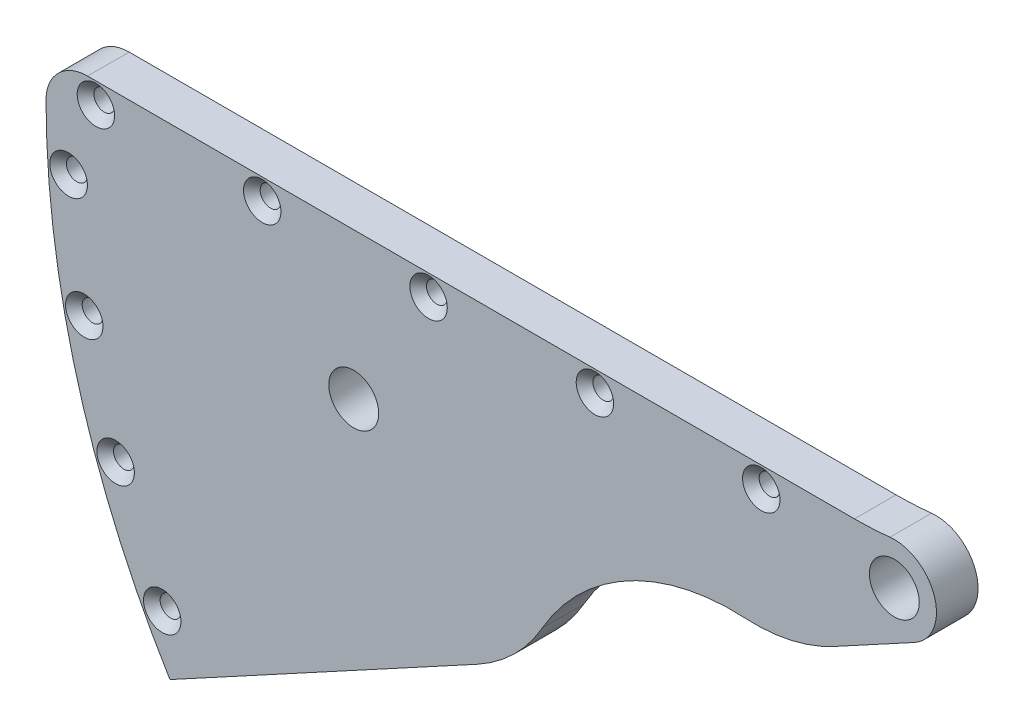
ISO-10303-21;
HEADER;
FILE_DESCRIPTION(('STEP AP214'),'2;1');
FILE_NAME('part.step','',(''),(''),'','','');
FILE_SCHEMA(('AUTOMOTIVE_DESIGN { 1 0 10303 214 1 1 1 1 }'));
ENDSEC;
DATA;
#1=APPLICATION_CONTEXT('core data for automotive mechanical design processes');
#2=APPLICATION_PROTOCOL_DEFINITION('international standard','automotive_design',2000,#1);
#3=PRODUCT_CONTEXT('',#1,'mechanical');
#4=PRODUCT('Part','Part','',(#3));
#5=PRODUCT_RELATED_PRODUCT_CATEGORY('part','',(#4));
#6=PRODUCT_DEFINITION_FORMATION('','',#4);
#7=PRODUCT_DEFINITION_CONTEXT('part definition',#1,'design');
#8=PRODUCT_DEFINITION('design','',#6,#7);
#9=PRODUCT_DEFINITION_SHAPE('','',#8);
#10=(LENGTH_UNIT() NAMED_UNIT(*) SI_UNIT(.MILLI.,.METRE.));
#11=(NAMED_UNIT(*) PLANE_ANGLE_UNIT() SI_UNIT($,.RADIAN.));
#12=(NAMED_UNIT(*) SI_UNIT($,.STERADIAN.) SOLID_ANGLE_UNIT());
#13=UNCERTAINTY_MEASURE_WITH_UNIT(LENGTH_MEASURE(1.E-05),#10,'distance_accuracy_value','');
#14=(GEOMETRIC_REPRESENTATION_CONTEXT(3) GLOBAL_UNCERTAINTY_ASSIGNED_CONTEXT((#13)) GLOBAL_UNIT_ASSIGNED_CONTEXT((#10,
#11,#12)) REPRESENTATION_CONTEXT('',''));
#15=CARTESIAN_POINT('',(0.,0.,0.));
#16=DIRECTION('',(0.,0.,1.));
#17=DIRECTION('',(1.,0.,0.));
#18=AXIS2_PLACEMENT_3D('',#15,#16,#17);
#19=CARTESIAN_POINT('',(70.,-12.3683000000001,10.));
#20=DIRECTION('',(0.,0.,1.));
#21=DIRECTION('',(1.,0.,0.));
#22=AXIS2_PLACEMENT_3D('',#19,#20,#21);
#23=PLANE('',#22);
#24=CARTESIAN_POINT('',(-106.053120049398,-105.138440243897,10.));
#25=DIRECTION('',(0.,0.,1.));
#26=DIRECTION('',(1.,0.,0.));
#27=AXIS2_PLACEMENT_3D('',#24,#25,#26);
#28=CIRCLE('',#27,4.50000000000003);
#29=CARTESIAN_POINT('',(-101.553120049398,-105.138440243897,10.));
#30=VERTEX_POINT('',#29);
#31=EDGE_CURVE('E202',#30,#30,#28,.F.);
#32=ORIENTED_EDGE('',*,*,#31,.T.);
#33=EDGE_LOOP('',(#32));
#34=FACE_BOUND('',#33,.T.);
#35=CARTESIAN_POINT('',(-117.250891281488,-79.7337489652391,10.));
#36=DIRECTION('',(0.,0.,1.));
#37=DIRECTION('',(1.,0.,0.));
#38=AXIS2_PLACEMENT_3D('',#35,#36,#37);
#39=CIRCLE('',#38,4.50000000000005);
#40=CARTESIAN_POINT('',(-112.750891281488,-79.7337489652391,10.));
#41=VERTEX_POINT('',#40);
#42=EDGE_CURVE('E199',#41,#41,#39,.F.);
#43=ORIENTED_EDGE('',*,*,#42,.T.);
#44=EDGE_LOOP('',(#43));
#45=FACE_BOUND('',#44,.T.);
#46=CARTESIAN_POINT('',(-124.804036909517,-53.0178658495351,10.));
#47=DIRECTION('',(0.,0.,1.));
#48=DIRECTION('',(1.,0.,0.));
#49=AXIS2_PLACEMENT_3D('',#46,#47,#48);
#50=CIRCLE('',#49,4.50000000000002);
#51=CARTESIAN_POINT('',(-120.304036909517,-53.0178658495351,10.));
#52=VERTEX_POINT('',#51);
#53=EDGE_CURVE('E196',#52,#52,#50,.F.);
#54=ORIENTED_EDGE('',*,*,#53,.T.);
#55=EDGE_LOOP('',(#54));
#56=FACE_BOUND('',#55,.T.);
#57=CARTESIAN_POINT('',(-128.565543545409,-25.5107851727687,10.));
#58=DIRECTION('',(0.,0.,1.));
#59=DIRECTION('',(1.,0.,0.));
#60=AXIS2_PLACEMENT_3D('',#57,#58,#59);
#61=CIRCLE('',#60,4.52853142709056);
#62=CARTESIAN_POINT('',(-124.037012118318,-25.5107851727687,10.));
#63=VERTEX_POINT('',#62);
#64=EDGE_CURVE('E193',#63,#63,#61,.F.);
#65=ORIENTED_EDGE('',*,*,#64,.T.);
#66=EDGE_LOOP('',(#65));
#67=FACE_BOUND('',#66,.T.);
#68=CARTESIAN_POINT('',(-60.,-38.0000000000001,10.));
#69=DIRECTION('',(0.,0.,1.));
#70=DIRECTION('',(1.,0.,0.));
#71=AXIS2_PLACEMENT_3D('',#68,#69,#70);
#72=CIRCLE('',#71,6.);
#73=CARTESIAN_POINT('',(-54.,-38.0000000000001,10.));
#74=VERTEX_POINT('',#73);
#75=EDGE_CURVE('E178',#74,#74,#72,.T.);
#76=ORIENTED_EDGE('',*,*,#75,.F.);
#77=EDGE_LOOP('',(#76));
#78=FACE_BOUND('',#77,.T.);
#79=CARTESIAN_POINT('',(70.,-12.3683000000001,10.));
#80=DIRECTION('',(0.,0.,1.));
#81=DIRECTION('',(1.,0.,0.));
#82=AXIS2_PLACEMENT_3D('',#79,#80,#81);
#83=CIRCLE('',#82,6.);
#84=CARTESIAN_POINT('',(76.,-12.3683000000001,10.));
#85=VERTEX_POINT('',#84);
#86=EDGE_CURVE('E174',#85,#85,#83,.T.);
#87=ORIENTED_EDGE('',*,*,#86,.F.);
#88=EDGE_LOOP('',(#87));
#89=FACE_BOUND('',#88,.T.);
#90=CARTESIAN_POINT('',(38.,-7.73660000000008,10.));
#91=DIRECTION('',(0.,0.,1.));
#92=DIRECTION('',(1.,0.,0.));
#93=AXIS2_PLACEMENT_3D('',#90,#91,#92);
#94=CIRCLE('',#93,4.50000000000003);
#95=CARTESIAN_POINT('',(42.5,-7.73660000000008,10.));
#96=VERTEX_POINT('',#95);
#97=EDGE_CURVE('E154',#96,#96,#94,.F.);
#98=ORIENTED_EDGE('',*,*,#97,.T.);
#99=EDGE_LOOP('',(#98));
#100=FACE_BOUND('',#99,.T.);
#101=CARTESIAN_POINT('',(-1.99999999999999,-7.73660000000007,10.));
#102=DIRECTION('',(0.,0.,1.));
#103=DIRECTION('',(1.,0.,0.));
#104=AXIS2_PLACEMENT_3D('',#101,#102,#103);
#105=CIRCLE('',#104,4.50000000000003);
#106=CARTESIAN_POINT('',(2.50000000000004,-7.73660000000007,10.));
#107=VERTEX_POINT('',#106);
#108=EDGE_CURVE('E151',#107,#107,#105,.F.);
#109=ORIENTED_EDGE('',*,*,#108,.T.);
#110=EDGE_LOOP('',(#109));
#111=FACE_BOUND('',#110,.T.);
#112=CARTESIAN_POINT('',(-42.,-7.73660000000007,10.));
#113=DIRECTION('',(0.,0.,1.));
#114=DIRECTION('',(1.,0.,0.));
#115=AXIS2_PLACEMENT_3D('',#112,#113,#114);
#116=CIRCLE('',#115,4.50000000000003);
#117=CARTESIAN_POINT('',(-37.5,-7.73660000000007,10.));
#118=VERTEX_POINT('',#117);
#119=EDGE_CURVE('E148',#118,#118,#116,.F.);
#120=ORIENTED_EDGE('',*,*,#119,.T.);
#121=EDGE_LOOP('',(#120));
#122=FACE_BOUND('',#121,.T.);
#123=CARTESIAN_POINT('',(-82.,-7.73660000000007,10.));
#124=DIRECTION('',(0.,0.,1.));
#125=DIRECTION('',(1.,0.,0.));
#126=AXIS2_PLACEMENT_3D('',#123,#124,#125);
#127=CIRCLE('',#126,4.50000000000003);
#128=CARTESIAN_POINT('',(-77.5,-7.73660000000007,10.));
#129=VERTEX_POINT('',#128);
#130=EDGE_CURVE('E145',#129,#129,#127,.F.);
#131=ORIENTED_EDGE('',*,*,#130,.T.);
#132=EDGE_LOOP('',(#131));
#133=FACE_BOUND('',#132,.T.);
#134=CARTESIAN_POINT('',(-122.,-7.73660000000007,10.));
#135=DIRECTION('',(0.,0.,1.));
#136=DIRECTION('',(1.,0.,0.));
#137=AXIS2_PLACEMENT_3D('',#134,#135,#136);
#138=CIRCLE('',#137,4.50000000000005);
#139=CARTESIAN_POINT('',(-117.5,-7.73660000000007,10.));
#140=VERTEX_POINT('',#139);
#141=EDGE_CURVE('E137',#140,#140,#138,.F.);
#142=ORIENTED_EDGE('',*,*,#141,.T.);
#143=EDGE_LOOP('',(#142));
#144=FACE_BOUND('',#143,.T.);
#145=CARTESIAN_POINT('',(70.,-12.3683000000001,10.));
#146=DIRECTION('',(0.,0.,1.));
#147=DIRECTION('',(1.,0.,0.));
#148=AXIS2_PLACEMENT_3D('',#145,#146,#147);
#149=CIRCLE('',#148,204.);
#150=CARTESIAN_POINT('',(-133.999632378806,-12.7555845360825,10.));
#151=VERTEX_POINT('',#150);
#152=CARTESIAN_POINT('',(-104.20534041752,-118.52148822351,10.));
#153=VERTEX_POINT('',#152);
#154=EDGE_CURVE('E121',#151,#153,#149,.T.);
#155=ORIENTED_EDGE('',*,*,#154,.T.);
#156=DIRECTION('',(0.878737629728587,0.477305120545532,0.));
#157=VECTOR('',#156,1.);
#158=CARTESIAN_POINT('',(-104.20534041752,-118.52148822351,10.));
#159=LINE('',#158,#157);
#160=CARTESIAN_POINT('',(-30.3442659503435,-78.4022673554259,10.));
#161=VERTEX_POINT('',#160);
#162=EDGE_CURVE('E110',#153,#161,#159,.T.);
#163=ORIENTED_EDGE('',*,*,#162,.T.);
#164=CARTESIAN_POINT('',(-49.4364707721648,-43.2527621662824,10.));
#165=DIRECTION('',(0.,0.,1.));
#166=DIRECTION('',(1.,0.,0.));
#167=AXIS2_PLACEMENT_3D('',#164,#165,#166);
#168=CIRCLE('',#167,40.);
#169=CARTESIAN_POINT('',(-14.6947042322307,-63.0772333492602,10.));
#170=VERTEX_POINT('',#169);
#171=EDGE_CURVE('E120',#161,#170,#168,.T.);
#172=ORIENTED_EDGE('',*,*,#171,.T.);
#173=CARTESIAN_POINT('',(31.1020131785029,-89.2099201699054,10.));
#174=DIRECTION('',(0.,0.,-1.));
#175=DIRECTION('',(1.,0.,0.));
#176=AXIS2_PLACEMENT_3D('',#173,#174,#175);
#177=CIRCLE('',#176,52.7281390347176);
#178=CARTESIAN_POINT('',(34.1104429036796,-36.5676748088536,10.));
#179=VERTEX_POINT('',#178);
#180=EDGE_CURVE('E257',#170,#179,#177,.T.);
#181=ORIENTED_EDGE('',*,*,#180,.T.);
#182=CARTESIAN_POINT('',(36.3926624397765,3.36716554376406,10.));
#183=DIRECTION('',(0.,0.,1.));
#184=DIRECTION('',(1.,0.,0.));
#185=AXIS2_PLACEMENT_3D('',#182,#183,#184);
#186=CIRCLE('',#185,40.);
#187=CARTESIAN_POINT('',(55.4848672615979,-31.7823396453794,10.));
#188=VERTEX_POINT('',#187);
#189=EDGE_CURVE('E279',#179,#188,#186,.T.);
#190=ORIENTED_EDGE('',*,*,#189,.T.);
#191=DIRECTION('',(0.878737629728587,0.477305120545532,0.));
#192=VECTOR('',#191,1.);
#193=CARTESIAN_POINT('',(55.4848672615979,-31.7823396453794,10.));
#194=LINE('',#193,#192);
#195=CARTESIAN_POINT('',(74.8359122898312,-21.2714060431212,10.));
#196=VERTEX_POINT('',#195);
#197=EDGE_CURVE('E276',#188,#196,#194,.T.);
#198=ORIENTED_EDGE('',*,*,#197,.T.);
#199=CARTESIAN_POINT('',(70.,-12.3683000000001,10.));
#200=DIRECTION('',(0.,0.,1.));
#201=DIRECTION('',(1.,0.,0.));
#202=AXIS2_PLACEMENT_3D('',#199,#200,#201);
#203=CIRCLE('',#202,10.1317);
#204=CARTESIAN_POINT('',(68.9458855954698,-2.29158487491284,10.));
#205=VERTEX_POINT('',#204);
#206=EDGE_CURVE('E275',#196,#205,#203,.T.);
#207=ORIENTED_EDGE('',*,*,#206,.T.);
#208=CARTESIAN_POINT('',(60.4145057508754,79.2633999999999,10.));
#209=DIRECTION('',(0.,0.,1.));
#210=DIRECTION('',(1.,0.,0.));
#211=AXIS2_PLACEMENT_3D('',#208,#209,#210);
#212=CIRCLE('',#211,82.);
#213=CARTESIAN_POINT('',(60.4145057508754,-2.73660000000008,10.));
#214=VERTEX_POINT('',#213);
#215=EDGE_CURVE('E11',#205,#214,#212,.F.);
#216=ORIENTED_EDGE('',*,*,#215,.T.);
#217=DIRECTION('',(-1.,0.,0.));
#218=VECTOR('',#217,1.);
#219=CARTESIAN_POINT('',(66.8564828615069,-2.73660000000008,10.));
#220=LINE('',#219,#218);
#221=CARTESIAN_POINT('',(-123.999650399453,-2.73660000000007,10.));
#222=VERTEX_POINT('',#221);
#223=EDGE_CURVE('E224',#214,#222,#220,.T.);
#224=ORIENTED_EDGE('',*,*,#223,.T.);
#225=CARTESIAN_POINT('',(-123.999650399453,-12.7366000000001,10.));
#226=DIRECTION('',(0.,0.,1.));
#227=DIRECTION('',(1.,0.,0.));
#228=AXIS2_PLACEMENT_3D('',#225,#226,#227);
#229=CIRCLE('',#228,9.99999999999999);
#230=EDGE_CURVE('E125',#222,#151,#229,.T.);
#231=ORIENTED_EDGE('',*,*,#230,.T.);
#232=EDGE_LOOP('',(#155,#163,#172,#181,#190,#198,#207,#216,#224,#231));
#233=FACE_BOUND('',#232,.T.);
#234=ADVANCED_FACE('F33',(#34,#45,#56,#67,#78,#89,#100,#111,#122,#133,#144,#233),#23,.T.);
#235=CARTESIAN_POINT('',(70.,-12.3683000000001,0.));
#236=DIRECTION('',(0.,0.,1.));
#237=DIRECTION('',(1.,0.,0.));
#238=AXIS2_PLACEMENT_3D('',#235,#236,#237);
#239=PLANE('',#238);
#240=CARTESIAN_POINT('',(-128.565543545409,-25.5107851727687,0.));
#241=DIRECTION('',(0.,0.,1.));
#242=DIRECTION('',(1.,0.,0.));
#243=AXIS2_PLACEMENT_3D('',#240,#241,#242);
#244=CIRCLE('',#243,2.52853142709059);
#245=CARTESIAN_POINT('',(-126.037012118318,-25.5107851727687,0.));
#246=VERTEX_POINT('',#245);
#247=EDGE_CURVE('E188',#246,#246,#244,.T.);
#248=ORIENTED_EDGE('',*,*,#247,.T.);
#249=EDGE_LOOP('',(#248));
#250=FACE_BOUND('',#249,.T.);
#251=CARTESIAN_POINT('',(-124.804036909517,-53.0178658495351,0.));
#252=DIRECTION('',(0.,0.,1.));
#253=DIRECTION('',(1.,0.,0.));
#254=AXIS2_PLACEMENT_3D('',#251,#252,#253);
#255=CIRCLE('',#254,2.49999999999999);
#256=CARTESIAN_POINT('',(-122.304036909517,-53.0178658495351,0.));
#257=VERTEX_POINT('',#256);
#258=EDGE_CURVE('E185',#257,#257,#255,.T.);
#259=ORIENTED_EDGE('',*,*,#258,.T.);
#260=EDGE_LOOP('',(#259));
#261=FACE_BOUND('',#260,.T.);
#262=CARTESIAN_POINT('',(-117.250891281488,-79.7337489652391,0.));
#263=DIRECTION('',(0.,0.,1.));
#264=DIRECTION('',(1.,0.,0.));
#265=AXIS2_PLACEMENT_3D('',#262,#263,#264);
#266=CIRCLE('',#265,2.50000000000001);
#267=CARTESIAN_POINT('',(-114.750891281488,-79.7337489652391,0.));
#268=VERTEX_POINT('',#267);
#269=EDGE_CURVE('E182',#268,#268,#266,.T.);
#270=ORIENTED_EDGE('',*,*,#269,.T.);
#271=EDGE_LOOP('',(#270));
#272=FACE_BOUND('',#271,.T.);
#273=CARTESIAN_POINT('',(-106.053120049398,-105.138440243897,0.));
#274=DIRECTION('',(0.,0.,1.));
#275=DIRECTION('',(1.,0.,0.));
#276=AXIS2_PLACEMENT_3D('',#273,#274,#275);
#277=CIRCLE('',#276,2.50000000000001);
#278=CARTESIAN_POINT('',(-103.553120049398,-105.138440243897,0.));
#279=VERTEX_POINT('',#278);
#280=EDGE_CURVE('E179',#279,#279,#277,.T.);
#281=ORIENTED_EDGE('',*,*,#280,.T.);
#282=EDGE_LOOP('',(#281));
#283=FACE_BOUND('',#282,.T.);
#284=CARTESIAN_POINT('',(-60.,-38.0000000000001,0.));
#285=DIRECTION('',(0.,0.,1.));
#286=DIRECTION('',(1.,0.,0.));
#287=AXIS2_PLACEMENT_3D('',#284,#285,#286);
#288=CIRCLE('',#287,6.);
#289=CARTESIAN_POINT('',(-54.,-38.0000000000001,0.));
#290=VERTEX_POINT('',#289);
#291=EDGE_CURVE('E175',#290,#290,#288,.T.);
#292=ORIENTED_EDGE('',*,*,#291,.T.);
#293=EDGE_LOOP('',(#292));
#294=FACE_BOUND('',#293,.T.);
#295=CARTESIAN_POINT('',(70.,-12.3683000000001,0.));
#296=DIRECTION('',(0.,0.,1.));
#297=DIRECTION('',(1.,0.,0.));
#298=AXIS2_PLACEMENT_3D('',#295,#296,#297);
#299=CIRCLE('',#298,6.);
#300=CARTESIAN_POINT('',(76.,-12.3683000000001,0.));
#301=VERTEX_POINT('',#300);
#302=EDGE_CURVE('E170',#301,#301,#299,.T.);
#303=ORIENTED_EDGE('',*,*,#302,.T.);
#304=EDGE_LOOP('',(#303));
#305=FACE_BOUND('',#304,.T.);
#306=CARTESIAN_POINT('',(70.,-12.3683000000001,0.));
#307=DIRECTION('',(0.,0.,1.));
#308=DIRECTION('',(1.,0.,0.));
#309=AXIS2_PLACEMENT_3D('',#306,#307,#308);
#310=CIRCLE('',#309,204.);
#311=CARTESIAN_POINT('',(-133.999632378806,-12.7555845360825,0.));
#312=VERTEX_POINT('',#311);
#313=CARTESIAN_POINT('',(-104.20534041752,-118.52148822351,0.));
#314=VERTEX_POINT('',#313);
#315=EDGE_CURVE('E133',#312,#314,#310,.T.);
#316=ORIENTED_EDGE('',*,*,#315,.F.);
#317=CARTESIAN_POINT('',(-123.999650399453,-12.7366000000001,0.));
#318=DIRECTION('',(0.,0.,1.));
#319=DIRECTION('',(1.,0.,0.));
#320=AXIS2_PLACEMENT_3D('',#317,#318,#319);
#321=CIRCLE('',#320,9.99999999999999);
#322=CARTESIAN_POINT('',(-123.999650399453,-2.73660000000007,0.));
#323=VERTEX_POINT('',#322);
#324=EDGE_CURVE('E129',#323,#312,#321,.T.);
#325=ORIENTED_EDGE('',*,*,#324,.F.);
#326=DIRECTION('',(-1.,0.,0.));
#327=VECTOR('',#326,1.);
#328=CARTESIAN_POINT('',(66.8564828615069,-2.73660000000008,0.));
#329=LINE('',#328,#327);
#330=CARTESIAN_POINT('',(60.4145057508754,-2.73660000000008,0.));
#331=VERTEX_POINT('',#330);
#332=EDGE_CURVE('E222',#331,#323,#329,.T.);
#333=ORIENTED_EDGE('',*,*,#332,.F.);
#334=CARTESIAN_POINT('',(60.4145057508754,79.2633999999999,0.));
#335=DIRECTION('',(0.,0.,1.));
#336=DIRECTION('',(1.,0.,0.));
#337=AXIS2_PLACEMENT_3D('',#334,#335,#336);
#338=CIRCLE('',#337,82.);
#339=CARTESIAN_POINT('',(68.9458855954698,-2.29158487491284,0.));
#340=VERTEX_POINT('',#339);
#341=EDGE_CURVE('E41',#331,#340,#338,.T.);
#342=ORIENTED_EDGE('',*,*,#341,.T.);
#343=CARTESIAN_POINT('',(70.,-12.3683000000001,0.));
#344=DIRECTION('',(0.,0.,1.));
#345=DIRECTION('',(1.,0.,0.));
#346=AXIS2_PLACEMENT_3D('',#343,#344,#345);
#347=CIRCLE('',#346,10.1317);
#348=CARTESIAN_POINT('',(74.8359122898312,-21.2714060431212,0.));
#349=VERTEX_POINT('',#348);
#350=EDGE_CURVE('E230',#349,#340,#347,.T.);
#351=ORIENTED_EDGE('',*,*,#350,.F.);
#352=DIRECTION('',(0.878737629728587,0.477305120545532,0.));
#353=VECTOR('',#352,1.);
#354=CARTESIAN_POINT('',(55.4848672615979,-31.7823396453794,0.));
#355=LINE('',#354,#353);
#356=CARTESIAN_POINT('',(55.4848672615979,-31.7823396453794,0.));
#357=VERTEX_POINT('',#356);
#358=EDGE_CURVE('E233',#357,#349,#355,.T.);
#359=ORIENTED_EDGE('',*,*,#358,.F.);
#360=CARTESIAN_POINT('',(36.3926624397765,3.36716554376406,0.));
#361=DIRECTION('',(0.,0.,1.));
#362=DIRECTION('',(1.,0.,0.));
#363=AXIS2_PLACEMENT_3D('',#360,#361,#362);
#364=CIRCLE('',#363,40.);
#365=CARTESIAN_POINT('',(34.1104429036796,-36.5676748088536,0.));
#366=VERTEX_POINT('',#365);
#367=EDGE_CURVE('E263',#366,#357,#364,.T.);
#368=ORIENTED_EDGE('',*,*,#367,.F.);
#369=CARTESIAN_POINT('',(31.1020131785029,-89.2099201699054,0.));
#370=DIRECTION('',(0.,0.,-1.));
#371=DIRECTION('',(1.,0.,0.));
#372=AXIS2_PLACEMENT_3D('',#369,#370,#371);
#373=CIRCLE('',#372,52.7281390347176);
#374=CARTESIAN_POINT('',(-14.6947042322307,-63.0772333492602,0.));
#375=VERTEX_POINT('',#374);
#376=EDGE_CURVE('E256',#375,#366,#373,.T.);
#377=ORIENTED_EDGE('',*,*,#376,.F.);
#378=CARTESIAN_POINT('',(-49.4364707721648,-43.2527621662824,0.));
#379=DIRECTION('',(0.,0.,1.));
#380=DIRECTION('',(1.,0.,0.));
#381=AXIS2_PLACEMENT_3D('',#378,#379,#380);
#382=CIRCLE('',#381,40.);
#383=CARTESIAN_POINT('',(-30.3442659503435,-78.4022673554259,0.));
#384=VERTEX_POINT('',#383);
#385=EDGE_CURVE('E261',#384,#375,#382,.T.);
#386=ORIENTED_EDGE('',*,*,#385,.F.);
#387=DIRECTION('',(0.878737629728587,0.477305120545532,0.));
#388=VECTOR('',#387,1.);
#389=CARTESIAN_POINT('',(-104.20534041752,-118.52148822351,0.));
#390=LINE('',#389,#388);
#391=EDGE_CURVE('E266',#314,#384,#390,.T.);
#392=ORIENTED_EDGE('',*,*,#391,.F.);
#393=EDGE_LOOP('',(#316,#325,#333,#342,#351,#359,#368,#377,#386,#392));
#394=FACE_BOUND('',#393,.T.);
#395=CARTESIAN_POINT('',(-122.,-7.73660000000007,0.));
#396=DIRECTION('',(0.,0.,1.));
#397=DIRECTION('',(1.,0.,0.));
#398=AXIS2_PLACEMENT_3D('',#395,#396,#397);
#399=CIRCLE('',#398,2.49999999999999);
#400=CARTESIAN_POINT('',(-119.5,-7.73660000000007,0.));
#401=VERTEX_POINT('',#400);
#402=EDGE_CURVE('E284',#401,#401,#399,.T.);
#403=ORIENTED_EDGE('',*,*,#402,.T.);
#404=EDGE_LOOP('',(#403));
#405=FACE_BOUND('',#404,.T.);
#406=CARTESIAN_POINT('',(-82.,-7.73660000000007,0.));
#407=DIRECTION('',(0.,0.,1.));
#408=DIRECTION('',(1.,0.,0.));
#409=AXIS2_PLACEMENT_3D('',#406,#407,#408);
#410=CIRCLE('',#409,2.49999999999999);
#411=CARTESIAN_POINT('',(-79.5,-7.73660000000007,0.));
#412=VERTEX_POINT('',#411);
#413=EDGE_CURVE('E632',#412,#412,#410,.T.);
#414=ORIENTED_EDGE('',*,*,#413,.T.);
#415=EDGE_LOOP('',(#414));
#416=FACE_BOUND('',#415,.T.);
#417=CARTESIAN_POINT('',(-42.,-7.73660000000007,0.));
#418=DIRECTION('',(0.,0.,1.));
#419=DIRECTION('',(1.,0.,0.));
#420=AXIS2_PLACEMENT_3D('',#417,#418,#419);
#421=CIRCLE('',#420,2.49999999999999);
#422=CARTESIAN_POINT('',(-39.5,-7.73660000000007,0.));
#423=VERTEX_POINT('',#422);
#424=EDGE_CURVE('E635',#423,#423,#421,.T.);
#425=ORIENTED_EDGE('',*,*,#424,.T.);
#426=EDGE_LOOP('',(#425));
#427=FACE_BOUND('',#426,.T.);
#428=CARTESIAN_POINT('',(-1.99999999999999,-7.73660000000007,0.));
#429=DIRECTION('',(0.,0.,1.));
#430=DIRECTION('',(1.,0.,0.));
#431=AXIS2_PLACEMENT_3D('',#428,#429,#430);
#432=CIRCLE('',#431,2.49999999999999);
#433=CARTESIAN_POINT('',(0.500000000000007,-7.73660000000007,0.));
#434=VERTEX_POINT('',#433);
#435=EDGE_CURVE('E640',#434,#434,#432,.T.);
#436=ORIENTED_EDGE('',*,*,#435,.T.);
#437=EDGE_LOOP('',(#436));
#438=FACE_BOUND('',#437,.T.);
#439=CARTESIAN_POINT('',(38.,-7.73660000000008,0.));
#440=DIRECTION('',(0.,0.,1.));
#441=DIRECTION('',(1.,0.,0.));
#442=AXIS2_PLACEMENT_3D('',#439,#440,#441);
#443=CIRCLE('',#442,2.49999999999999);
#444=CARTESIAN_POINT('',(40.5,-7.73660000000008,0.));
#445=VERTEX_POINT('',#444);
#446=EDGE_CURVE('E173',#445,#445,#443,.T.);
#447=ORIENTED_EDGE('',*,*,#446,.T.);
#448=EDGE_LOOP('',(#447));
#449=FACE_BOUND('',#448,.T.);
#450=ADVANCED_FACE('F228',(#250,#261,#272,#283,#294,#305,#394,#405,#416,#427,#438,#449),#239,.F.);
#451=CARTESIAN_POINT('',(70.,-12.3683000000001,10.));
#452=DIRECTION('',(0.,0.,-1.));
#453=DIRECTION('',(-1.,0.,0.));
#454=AXIS2_PLACEMENT_3D('',#451,#452,#453);
#455=CYLINDRICAL_SURFACE('',#454,204.);
#456=ORIENTED_EDGE('',*,*,#315,.T.);
#457=DIRECTION('',(0.,0.,-1.));
#458=VECTOR('',#457,1.);
#459=CARTESIAN_POINT('',(-104.20534041752,-118.52148822351,10.));
#460=LINE('',#459,#458);
#461=EDGE_CURVE('E114',#153,#314,#460,.T.);
#462=ORIENTED_EDGE('',*,*,#461,.F.);
#463=ORIENTED_EDGE('',*,*,#154,.F.);
#464=DIRECTION('',(0.,0.,-1.));
#465=VECTOR('',#464,1.);
#466=CARTESIAN_POINT('',(-133.999632378806,-12.7555845360825,10.));
#467=LINE('',#466,#465);
#468=EDGE_CURVE('E237',#151,#312,#467,.T.);
#469=ORIENTED_EDGE('',*,*,#468,.T.);
#470=EDGE_LOOP('',(#456,#462,#463,#469));
#471=FACE_BOUND('',#470,.T.);
#472=ADVANCED_FACE('F131',(#471),#455,.T.);
#473=CARTESIAN_POINT('',(-104.20534041752,-118.52148822351,10.));
#474=DIRECTION('',(-0.477305120545532,0.878737629728587,0.));
#475=DIRECTION('',(-0.878737629728587,-0.477305120545532,0.));
#476=AXIS2_PLACEMENT_3D('',#473,#474,#475);
#477=PLANE('',#476);
#478=ORIENTED_EDGE('',*,*,#391,.T.);
#479=DIRECTION('',(0.,0.,-1.));
#480=VECTOR('',#479,1.);
#481=CARTESIAN_POINT('',(-30.3442659503435,-78.4022673554259,10.));
#482=LINE('',#481,#480);
#483=EDGE_CURVE('E117',#161,#384,#482,.T.);
#484=ORIENTED_EDGE('',*,*,#483,.F.);
#485=ORIENTED_EDGE('',*,*,#162,.F.);
#486=ORIENTED_EDGE('',*,*,#461,.T.);
#487=EDGE_LOOP('',(#478,#484,#485,#486));
#488=FACE_BOUND('',#487,.T.);
#489=ADVANCED_FACE('F112',(#488),#477,.F.);
#490=CARTESIAN_POINT('',(-49.4364707721648,-43.2527621662824,10.));
#491=DIRECTION('',(0.,0.,-1.));
#492=DIRECTION('',(-1.,0.,0.));
#493=AXIS2_PLACEMENT_3D('',#490,#491,#492);
#494=CYLINDRICAL_SURFACE('',#493,40.);
#495=ORIENTED_EDGE('',*,*,#385,.T.);
#496=DIRECTION('',(0.,0.,-1.));
#497=VECTOR('',#496,1.);
#498=CARTESIAN_POINT('',(-14.6947042322307,-63.0772333492602,10.));
#499=LINE('',#498,#497);
#500=EDGE_CURVE('E139',#170,#375,#499,.T.);
#501=ORIENTED_EDGE('',*,*,#500,.F.);
#502=ORIENTED_EDGE('',*,*,#171,.F.);
#503=ORIENTED_EDGE('',*,*,#483,.T.);
#504=EDGE_LOOP('',(#495,#501,#502,#503));
#505=FACE_BOUND('',#504,.T.);
#506=ADVANCED_FACE('F285',(#505),#494,.T.);
#507=CARTESIAN_POINT('',(31.1020131785029,-89.2099201699054,10.));
#508=DIRECTION('',(0.,0.,-1.));
#509=DIRECTION('',(-1.,0.,0.));
#510=AXIS2_PLACEMENT_3D('',#507,#508,#509);
#511=CYLINDRICAL_SURFACE('',#510,52.7281390347176);
#512=ORIENTED_EDGE('',*,*,#376,.T.);
#513=DIRECTION('',(0.,0.,-1.));
#514=VECTOR('',#513,1.);
#515=CARTESIAN_POINT('',(34.1104429036796,-36.5676748088536,10.));
#516=LINE('',#515,#514);
#517=EDGE_CURVE('E247',#179,#366,#516,.T.);
#518=ORIENTED_EDGE('',*,*,#517,.F.);
#519=ORIENTED_EDGE('',*,*,#180,.F.);
#520=ORIENTED_EDGE('',*,*,#500,.T.);
#521=EDGE_LOOP('',(#512,#518,#519,#520));
#522=FACE_BOUND('',#521,.T.);
#523=ADVANCED_FACE('F254',(#522),#511,.F.);
#524=CARTESIAN_POINT('',(36.3926624397765,3.36716554376406,10.));
#525=DIRECTION('',(0.,0.,-1.));
#526=DIRECTION('',(-1.,0.,0.));
#527=AXIS2_PLACEMENT_3D('',#524,#525,#526);
#528=CYLINDRICAL_SURFACE('',#527,40.);
#529=ORIENTED_EDGE('',*,*,#367,.T.);
#530=DIRECTION('',(0.,0.,-1.));
#531=VECTOR('',#530,1.);
#532=CARTESIAN_POINT('',(55.4848672615979,-31.7823396453794,10.));
#533=LINE('',#532,#531);
#534=EDGE_CURVE('E244',#188,#357,#533,.T.);
#535=ORIENTED_EDGE('',*,*,#534,.F.);
#536=ORIENTED_EDGE('',*,*,#189,.F.);
#537=ORIENTED_EDGE('',*,*,#517,.T.);
#538=EDGE_LOOP('',(#529,#535,#536,#537));
#539=FACE_BOUND('',#538,.T.);
#540=ADVANCED_FACE('F290',(#539),#528,.T.);
#541=CARTESIAN_POINT('',(55.4848672615979,-31.7823396453794,10.));
#542=DIRECTION('',(-0.477305120545532,0.878737629728587,0.));
#543=DIRECTION('',(-0.878737629728587,-0.477305120545532,0.));
#544=AXIS2_PLACEMENT_3D('',#541,#542,#543);
#545=PLANE('',#544);
#546=ORIENTED_EDGE('',*,*,#358,.T.);
#547=DIRECTION('',(0.,0.,-1.));
#548=VECTOR('',#547,1.);
#549=CARTESIAN_POINT('',(74.8359122898312,-21.2714060431212,10.));
#550=LINE('',#549,#548);
#551=EDGE_CURVE('E241',#196,#349,#550,.T.);
#552=ORIENTED_EDGE('',*,*,#551,.F.);
#553=ORIENTED_EDGE('',*,*,#197,.F.);
#554=ORIENTED_EDGE('',*,*,#534,.T.);
#555=EDGE_LOOP('',(#546,#552,#553,#554));
#556=FACE_BOUND('',#555,.T.);
#557=ADVANCED_FACE('F271',(#556),#545,.F.);
#558=CARTESIAN_POINT('',(70.,-12.3683000000001,10.));
#559=DIRECTION('',(0.,0.,-1.));
#560=DIRECTION('',(-1.,0.,0.));
#561=AXIS2_PLACEMENT_3D('',#558,#559,#560);
#562=CYLINDRICAL_SURFACE('',#561,10.1317);
#563=ORIENTED_EDGE('',*,*,#350,.T.);
#564=DIRECTION('',(0.,0.,-1.));
#565=VECTOR('',#564,1.);
#566=CARTESIAN_POINT('',(68.9458855954698,-2.29158487491284,10.));
#567=LINE('',#566,#565);
#568=EDGE_CURVE('E48',#340,#205,#567,.F.);
#569=ORIENTED_EDGE('',*,*,#568,.T.);
#570=ORIENTED_EDGE('',*,*,#206,.F.);
#571=ORIENTED_EDGE('',*,*,#551,.T.);
#572=EDGE_LOOP('',(#563,#569,#570,#571));
#573=FACE_BOUND('',#572,.T.);
#574=ADVANCED_FACE('F274',(#573),#562,.T.);
#575=CARTESIAN_POINT('',(66.8564828615069,-2.73660000000008,10.));
#576=DIRECTION('',(0.,-1.,0.));
#577=DIRECTION('',(1.,0.,0.));
#578=AXIS2_PLACEMENT_3D('',#575,#576,#577);
#579=PLANE('',#578);
#580=ORIENTED_EDGE('',*,*,#223,.F.);
#581=DIRECTION('',(0.,0.,1.));
#582=VECTOR('',#581,1.);
#583=CARTESIAN_POINT('',(60.4145057508754,-2.73660000000008,0.));
#584=LINE('',#583,#582);
#585=EDGE_CURVE('E214',#214,#331,#584,.F.);
#586=ORIENTED_EDGE('',*,*,#585,.T.);
#587=ORIENTED_EDGE('',*,*,#332,.T.);
#588=DIRECTION('',(0.,0.,-1.));
#589=VECTOR('',#588,1.);
#590=CARTESIAN_POINT('',(-123.999650399453,-2.73660000000007,10.));
#591=LINE('',#590,#589);
#592=EDGE_CURVE('E239',#222,#323,#591,.T.);
#593=ORIENTED_EDGE('',*,*,#592,.F.);
#594=EDGE_LOOP('',(#580,#586,#587,#593));
#595=FACE_BOUND('',#594,.T.);
#596=ADVANCED_FACE('F220',(#595),#579,.F.);
#597=CARTESIAN_POINT('',(-123.999650399453,-12.7366000000001,10.));
#598=DIRECTION('',(0.,0.,-1.));
#599=DIRECTION('',(-1.,0.,0.));
#600=AXIS2_PLACEMENT_3D('',#597,#598,#599);
#601=CYLINDRICAL_SURFACE('',#600,9.99999999999999);
#602=ORIENTED_EDGE('',*,*,#324,.T.);
#603=ORIENTED_EDGE('',*,*,#468,.F.);
#604=ORIENTED_EDGE('',*,*,#230,.F.);
#605=ORIENTED_EDGE('',*,*,#592,.T.);
#606=EDGE_LOOP('',(#602,#603,#604,#605));
#607=FACE_BOUND('',#606,.T.);
#608=ADVANCED_FACE('F312',(#607),#601,.T.);
#609=CARTESIAN_POINT('',(-122.,-7.73660000000007,10.));
#610=DIRECTION('',(0.,0.,-1.));
#611=DIRECTION('',(-1.,0.,0.));
#612=AXIS2_PLACEMENT_3D('',#609,#610,#611);
#613=CYLINDRICAL_SURFACE('',#612,2.49999999999999);
#614=CARTESIAN_POINT('',(-122.,-7.73660000000007,7.99999999999995));
#615=DIRECTION('',(0.,0.,1.));
#616=DIRECTION('',(1.,0.,0.));
#617=AXIS2_PLACEMENT_3D('',#614,#615,#616);
#618=CIRCLE('',#617,2.49999999999999);
#619=CARTESIAN_POINT('',(-119.5,-7.73660000000007,7.99999999999995));
#620=VERTEX_POINT('',#619);
#621=EDGE_CURVE('E166',#620,#620,#618,.T.);
#622=ORIENTED_EDGE('',*,*,#621,.T.);
#623=EDGE_LOOP('',(#622));
#624=FACE_BOUND('',#623,.T.);
#625=ORIENTED_EDGE('',*,*,#402,.F.);
#626=EDGE_LOOP('',(#625));
#627=FACE_BOUND('',#626,.T.);
#628=ADVANCED_FACE('F309',(#624,#627),#613,.F.);
#629=CARTESIAN_POINT('',(-82.,-7.73660000000007,10.));
#630=DIRECTION('',(0.,0.,-1.));
#631=DIRECTION('',(-1.,0.,0.));
#632=AXIS2_PLACEMENT_3D('',#629,#630,#631);
#633=CYLINDRICAL_SURFACE('',#632,2.49999999999999);
#634=CARTESIAN_POINT('',(-82.,-7.73660000000007,7.99999999999995));
#635=DIRECTION('',(0.,0.,1.));
#636=DIRECTION('',(1.,0.,0.));
#637=AXIS2_PLACEMENT_3D('',#634,#635,#636);
#638=CIRCLE('',#637,2.49999999999999);
#639=CARTESIAN_POINT('',(-79.5,-7.73660000000007,7.99999999999995));
#640=VERTEX_POINT('',#639);
#641=EDGE_CURVE('E163',#640,#640,#638,.T.);
#642=ORIENTED_EDGE('',*,*,#641,.T.);
#643=EDGE_LOOP('',(#642));
#644=FACE_BOUND('',#643,.T.);
#645=ORIENTED_EDGE('',*,*,#413,.F.);
#646=EDGE_LOOP('',(#645));
#647=FACE_BOUND('',#646,.T.);
#648=ADVANCED_FACE('F339',(#644,#647),#633,.F.);
#649=CARTESIAN_POINT('',(-42.,-7.73660000000007,10.));
#650=DIRECTION('',(0.,0.,-1.));
#651=DIRECTION('',(-1.,0.,0.));
#652=AXIS2_PLACEMENT_3D('',#649,#650,#651);
#653=CYLINDRICAL_SURFACE('',#652,2.49999999999999);
#654=CARTESIAN_POINT('',(-42.,-7.73660000000007,7.99999999999995));
#655=DIRECTION('',(0.,0.,1.));
#656=DIRECTION('',(1.,0.,0.));
#657=AXIS2_PLACEMENT_3D('',#654,#655,#656);
#658=CIRCLE('',#657,2.49999999999999);
#659=CARTESIAN_POINT('',(-39.5,-7.73660000000007,7.99999999999995));
#660=VERTEX_POINT('',#659);
#661=EDGE_CURVE('E160',#660,#660,#658,.T.);
#662=ORIENTED_EDGE('',*,*,#661,.T.);
#663=EDGE_LOOP('',(#662));
#664=FACE_BOUND('',#663,.T.);
#665=ORIENTED_EDGE('',*,*,#424,.F.);
#666=EDGE_LOOP('',(#665));
#667=FACE_BOUND('',#666,.T.);
#668=ADVANCED_FACE('F346',(#664,#667),#653,.F.);
#669=CARTESIAN_POINT('',(-1.99999999999999,-7.73660000000007,10.));
#670=DIRECTION('',(0.,0.,-1.));
#671=DIRECTION('',(-1.,0.,0.));
#672=AXIS2_PLACEMENT_3D('',#669,#670,#671);
#673=CYLINDRICAL_SURFACE('',#672,2.49999999999999);
#674=CARTESIAN_POINT('',(-1.99999999999999,-7.73660000000007,7.99999999999995));
#675=DIRECTION('',(0.,0.,1.));
#676=DIRECTION('',(1.,0.,0.));
#677=AXIS2_PLACEMENT_3D('',#674,#675,#676);
#678=CIRCLE('',#677,2.49999999999999);
#679=CARTESIAN_POINT('',(0.500000000000007,-7.73660000000007,7.99999999999995));
#680=VERTEX_POINT('',#679);
#681=EDGE_CURVE('E157',#680,#680,#678,.T.);
#682=ORIENTED_EDGE('',*,*,#681,.T.);
#683=EDGE_LOOP('',(#682));
#684=FACE_BOUND('',#683,.T.);
#685=ORIENTED_EDGE('',*,*,#435,.F.);
#686=EDGE_LOOP('',(#685));
#687=FACE_BOUND('',#686,.T.);
#688=ADVANCED_FACE('F353',(#684,#687),#673,.F.);
#689=CARTESIAN_POINT('',(38.,-7.73660000000008,10.));
#690=DIRECTION('',(0.,0.,-1.));
#691=DIRECTION('',(-1.,0.,0.));
#692=AXIS2_PLACEMENT_3D('',#689,#690,#691);
#693=CYLINDRICAL_SURFACE('',#692,2.49999999999999);
#694=CARTESIAN_POINT('',(38.,-7.73660000000008,7.99999999999995));
#695=DIRECTION('',(0.,0.,1.));
#696=DIRECTION('',(1.,0.,0.));
#697=AXIS2_PLACEMENT_3D('',#694,#695,#696);
#698=CIRCLE('',#697,2.49999999999999);
#699=CARTESIAN_POINT('',(40.5,-7.73660000000008,7.99999999999995));
#700=VERTEX_POINT('',#699);
#701=EDGE_CURVE('E134',#700,#700,#698,.T.);
#702=ORIENTED_EDGE('',*,*,#701,.T.);
#703=EDGE_LOOP('',(#702));
#704=FACE_BOUND('',#703,.T.);
#705=ORIENTED_EDGE('',*,*,#446,.F.);
#706=EDGE_LOOP('',(#705));
#707=FACE_BOUND('',#706,.T.);
#708=ADVANCED_FACE('F361',(#704,#707),#693,.F.);
#709=CARTESIAN_POINT('',(38.,-7.73660000000008,7.99999999999995));
#710=DIRECTION('',(0.,0.,1.));
#711=DIRECTION('',(1.,0.,0.));
#712=AXIS2_PLACEMENT_3D('',#709,#710,#711);
#713=CONICAL_SURFACE('',#712,2.49999999999999,0.785398163397446);
#714=ORIENTED_EDGE('',*,*,#97,.F.);
#715=EDGE_LOOP('',(#714));
#716=FACE_BOUND('',#715,.T.);
#717=ORIENTED_EDGE('',*,*,#701,.F.);
#718=EDGE_LOOP('',(#717));
#719=FACE_BOUND('',#718,.T.);
#720=ADVANCED_FACE('F369',(#716,#719),#713,.F.);
#721=CARTESIAN_POINT('',(-1.99999999999999,-7.73660000000007,7.99999999999995));
#722=DIRECTION('',(0.,0.,1.));
#723=DIRECTION('',(1.,0.,0.));
#724=AXIS2_PLACEMENT_3D('',#721,#722,#723);
#725=CONICAL_SURFACE('',#724,2.49999999999999,0.785398163397446);
#726=ORIENTED_EDGE('',*,*,#108,.F.);
#727=EDGE_LOOP('',(#726));
#728=FACE_BOUND('',#727,.T.);
#729=ORIENTED_EDGE('',*,*,#681,.F.);
#730=EDGE_LOOP('',(#729));
#731=FACE_BOUND('',#730,.T.);
#732=ADVANCED_FACE('F377',(#728,#731),#725,.F.);
#733=CARTESIAN_POINT('',(-42.,-7.73660000000007,7.99999999999995));
#734=DIRECTION('',(0.,0.,1.));
#735=DIRECTION('',(1.,0.,0.));
#736=AXIS2_PLACEMENT_3D('',#733,#734,#735);
#737=CONICAL_SURFACE('',#736,2.49999999999999,0.785398163397446);
#738=ORIENTED_EDGE('',*,*,#119,.F.);
#739=EDGE_LOOP('',(#738));
#740=FACE_BOUND('',#739,.T.);
#741=ORIENTED_EDGE('',*,*,#661,.F.);
#742=EDGE_LOOP('',(#741));
#743=FACE_BOUND('',#742,.T.);
#744=ADVANCED_FACE('F385',(#740,#743),#737,.F.);
#745=CARTESIAN_POINT('',(-82.,-7.73660000000007,7.99999999999995));
#746=DIRECTION('',(0.,0.,1.));
#747=DIRECTION('',(1.,0.,0.));
#748=AXIS2_PLACEMENT_3D('',#745,#746,#747);
#749=CONICAL_SURFACE('',#748,2.49999999999999,0.785398163397446);
#750=ORIENTED_EDGE('',*,*,#130,.F.);
#751=EDGE_LOOP('',(#750));
#752=FACE_BOUND('',#751,.T.);
#753=ORIENTED_EDGE('',*,*,#641,.F.);
#754=EDGE_LOOP('',(#753));
#755=FACE_BOUND('',#754,.T.);
#756=ADVANCED_FACE('F393',(#752,#755),#749,.F.);
#757=CARTESIAN_POINT('',(-122.,-7.73660000000007,7.99999999999995));
#758=DIRECTION('',(0.,0.,1.));
#759=DIRECTION('',(1.,0.,0.));
#760=AXIS2_PLACEMENT_3D('',#757,#758,#759);
#761=CONICAL_SURFACE('',#760,2.49999999999999,0.785398163397449);
#762=ORIENTED_EDGE('',*,*,#141,.F.);
#763=EDGE_LOOP('',(#762));
#764=FACE_BOUND('',#763,.T.);
#765=ORIENTED_EDGE('',*,*,#621,.F.);
#766=EDGE_LOOP('',(#765));
#767=FACE_BOUND('',#766,.T.);
#768=ADVANCED_FACE('F401',(#764,#767),#761,.F.);
#769=CARTESIAN_POINT('',(70.,-12.3683000000001,-38.));
#770=DIRECTION('',(0.,0.,1.));
#771=DIRECTION('',(1.,0.,0.));
#772=AXIS2_PLACEMENT_3D('',#769,#770,#771);
#773=CYLINDRICAL_SURFACE('',#772,6.);
#774=ORIENTED_EDGE('',*,*,#86,.T.);
#775=EDGE_LOOP('',(#774));
#776=FACE_BOUND('',#775,.T.);
#777=ORIENTED_EDGE('',*,*,#302,.F.);
#778=EDGE_LOOP('',(#777));
#779=FACE_BOUND('',#778,.T.);
#780=ADVANCED_FACE('F409',(#776,#779),#773,.F.);
#781=CARTESIAN_POINT('',(-60.,-38.0000000000001,-4.));
#782=DIRECTION('',(0.,0.,1.));
#783=DIRECTION('',(1.,0.,0.));
#784=AXIS2_PLACEMENT_3D('',#781,#782,#783);
#785=CYLINDRICAL_SURFACE('',#784,6.);
#786=ORIENTED_EDGE('',*,*,#75,.T.);
#787=EDGE_LOOP('',(#786));
#788=FACE_BOUND('',#787,.T.);
#789=ORIENTED_EDGE('',*,*,#291,.F.);
#790=EDGE_LOOP('',(#789));
#791=FACE_BOUND('',#790,.T.);
#792=ADVANCED_FACE('F417',(#788,#791),#785,.F.);
#793=CARTESIAN_POINT('',(-106.053120049398,-105.138440243897,-4.));
#794=DIRECTION('',(0.,0.,1.));
#795=DIRECTION('',(1.,0.,0.));
#796=AXIS2_PLACEMENT_3D('',#793,#794,#795);
#797=CYLINDRICAL_SURFACE('',#796,2.50000000000001);
#798=CARTESIAN_POINT('',(-106.053120049398,-105.138440243897,7.99999999999997));
#799=DIRECTION('',(0.,0.,1.));
#800=DIRECTION('',(1.,0.,0.));
#801=AXIS2_PLACEMENT_3D('',#798,#799,#800);
#802=CIRCLE('',#801,2.50000000000001);
#803=CARTESIAN_POINT('',(-103.553120049398,-105.138440243897,7.99999999999997));
#804=VERTEX_POINT('',#803);
#805=EDGE_CURVE('E169',#804,#804,#802,.T.);
#806=ORIENTED_EDGE('',*,*,#805,.T.);
#807=EDGE_LOOP('',(#806));
#808=FACE_BOUND('',#807,.T.);
#809=ORIENTED_EDGE('',*,*,#280,.F.);
#810=EDGE_LOOP('',(#809));
#811=FACE_BOUND('',#810,.T.);
#812=ADVANCED_FACE('F425',(#808,#811),#797,.F.);
#813=CARTESIAN_POINT('',(-117.250891281488,-79.7337489652391,-4.));
#814=DIRECTION('',(0.,0.,1.));
#815=DIRECTION('',(1.,0.,0.));
#816=AXIS2_PLACEMENT_3D('',#813,#814,#815);
#817=CYLINDRICAL_SURFACE('',#816,2.50000000000001);
#818=CARTESIAN_POINT('',(-117.250891281488,-79.7337489652391,7.99999999999997));
#819=DIRECTION('',(0.,0.,1.));
#820=DIRECTION('',(1.,0.,0.));
#821=AXIS2_PLACEMENT_3D('',#818,#819,#820);
#822=CIRCLE('',#821,2.50000000000001);
#823=CARTESIAN_POINT('',(-114.750891281488,-79.7337489652391,7.99999999999997));
#824=VERTEX_POINT('',#823);
#825=EDGE_CURVE('E205',#824,#824,#822,.T.);
#826=ORIENTED_EDGE('',*,*,#825,.T.);
#827=EDGE_LOOP('',(#826));
#828=FACE_BOUND('',#827,.T.);
#829=ORIENTED_EDGE('',*,*,#269,.F.);
#830=EDGE_LOOP('',(#829));
#831=FACE_BOUND('',#830,.T.);
#832=ADVANCED_FACE('F433',(#828,#831),#817,.F.);
#833=CARTESIAN_POINT('',(-124.804036909517,-53.0178658495351,-4.));
#834=DIRECTION('',(0.,0.,1.));
#835=DIRECTION('',(1.,0.,0.));
#836=AXIS2_PLACEMENT_3D('',#833,#834,#835);
#837=CYLINDRICAL_SURFACE('',#836,2.49999999999999);
#838=CARTESIAN_POINT('',(-124.804036909517,-53.0178658495351,7.99999999999995));
#839=DIRECTION('',(0.,0.,1.));
#840=DIRECTION('',(1.,0.,0.));
#841=AXIS2_PLACEMENT_3D('',#838,#839,#840);
#842=CIRCLE('',#841,2.49999999999999);
#843=CARTESIAN_POINT('',(-122.304036909517,-53.0178658495351,7.99999999999995));
#844=VERTEX_POINT('',#843);
#845=EDGE_CURVE('E208',#844,#844,#842,.T.);
#846=ORIENTED_EDGE('',*,*,#845,.T.);
#847=EDGE_LOOP('',(#846));
#848=FACE_BOUND('',#847,.T.);
#849=ORIENTED_EDGE('',*,*,#258,.F.);
#850=EDGE_LOOP('',(#849));
#851=FACE_BOUND('',#850,.T.);
#852=ADVANCED_FACE('F441',(#848,#851),#837,.F.);
#853=CARTESIAN_POINT('',(-128.565543545409,-25.5107851727687,-4.));
#854=DIRECTION('',(0.,0.,1.));
#855=DIRECTION('',(1.,0.,0.));
#856=AXIS2_PLACEMENT_3D('',#853,#854,#855);
#857=CYLINDRICAL_SURFACE('',#856,2.52853142709059);
#858=CARTESIAN_POINT('',(-128.565543545409,-25.5107851727687,8.00000000000003));
#859=DIRECTION('',(0.,0.,1.));
#860=DIRECTION('',(1.,0.,0.));
#861=AXIS2_PLACEMENT_3D('',#858,#859,#860);
#862=CIRCLE('',#861,2.52853142709059);
#863=CARTESIAN_POINT('',(-126.037012118318,-25.5107851727687,8.00000000000003));
#864=VERTEX_POINT('',#863);
#865=EDGE_CURVE('E211',#864,#864,#862,.T.);
#866=ORIENTED_EDGE('',*,*,#865,.T.);
#867=EDGE_LOOP('',(#866));
#868=FACE_BOUND('',#867,.T.);
#869=ORIENTED_EDGE('',*,*,#247,.F.);
#870=EDGE_LOOP('',(#869));
#871=FACE_BOUND('',#870,.T.);
#872=ADVANCED_FACE('F449',(#868,#871),#857,.F.);
#873=CARTESIAN_POINT('',(-106.053120049398,-105.138440243897,7.99999999999997));
#874=DIRECTION('',(0.,0.,1.));
#875=DIRECTION('',(1.,0.,0.));
#876=AXIS2_PLACEMENT_3D('',#873,#874,#875);
#877=CONICAL_SURFACE('',#876,2.50000000000001,0.785398163397446);
#878=ORIENTED_EDGE('',*,*,#31,.F.);
#879=EDGE_LOOP('',(#878));
#880=FACE_BOUND('',#879,.T.);
#881=ORIENTED_EDGE('',*,*,#805,.F.);
#882=EDGE_LOOP('',(#881));
#883=FACE_BOUND('',#882,.T.);
#884=ADVANCED_FACE('F457',(#880,#883),#877,.F.);
#885=CARTESIAN_POINT('',(-117.250891281488,-79.7337489652391,7.99999999999997));
#886=DIRECTION('',(0.,0.,1.));
#887=DIRECTION('',(1.,0.,0.));
#888=AXIS2_PLACEMENT_3D('',#885,#886,#887);
#889=CONICAL_SURFACE('',#888,2.50000000000001,0.78539816339745);
#890=ORIENTED_EDGE('',*,*,#42,.F.);
#891=EDGE_LOOP('',(#890));
#892=FACE_BOUND('',#891,.T.);
#893=ORIENTED_EDGE('',*,*,#825,.F.);
#894=EDGE_LOOP('',(#893));
#895=FACE_BOUND('',#894,.T.);
#896=ADVANCED_FACE('F465',(#892,#895),#889,.F.);
#897=CARTESIAN_POINT('',(-124.804036909517,-53.0178658495351,7.99999999999995));
#898=DIRECTION('',(0.,0.,1.));
#899=DIRECTION('',(1.,0.,0.));
#900=AXIS2_PLACEMENT_3D('',#897,#898,#899);
#901=CONICAL_SURFACE('',#900,2.49999999999999,0.785398163397443);
#902=ORIENTED_EDGE('',*,*,#53,.F.);
#903=EDGE_LOOP('',(#902));
#904=FACE_BOUND('',#903,.T.);
#905=ORIENTED_EDGE('',*,*,#845,.F.);
#906=EDGE_LOOP('',(#905));
#907=FACE_BOUND('',#906,.T.);
#908=ADVANCED_FACE('F473',(#904,#907),#901,.F.);
#909=CARTESIAN_POINT('',(-128.565543545409,-25.5107851727687,8.00000000000003));
#910=DIRECTION('',(0.,0.,1.));
#911=DIRECTION('',(1.,0.,0.));
#912=AXIS2_PLACEMENT_3D('',#909,#910,#911);
#913=CONICAL_SURFACE('',#912,2.52853142709059,0.785398163397446);
#914=ORIENTED_EDGE('',*,*,#64,.F.);
#915=EDGE_LOOP('',(#914));
#916=FACE_BOUND('',#915,.T.);
#917=ORIENTED_EDGE('',*,*,#865,.F.);
#918=EDGE_LOOP('',(#917));
#919=FACE_BOUND('',#918,.T.);
#920=ADVANCED_FACE('F481',(#916,#919),#913,.F.);
#921=CARTESIAN_POINT('',(60.4145057508754,79.2633999999999,10.));
#922=DIRECTION('',(0.,0.,-1.));
#923=DIRECTION('',(-1.,0.,0.));
#924=AXIS2_PLACEMENT_3D('',#921,#922,#923);
#925=CYLINDRICAL_SURFACE('',#924,82.);
#926=ORIENTED_EDGE('',*,*,#215,.F.);
#927=ORIENTED_EDGE('',*,*,#568,.F.);
#928=ORIENTED_EDGE('',*,*,#341,.F.);
#929=ORIENTED_EDGE('',*,*,#585,.F.);
#930=EDGE_LOOP('',(#926,#927,#928,#929));
#931=FACE_BOUND('',#930,.T.);
#932=ADVANCED_FACE('F35',(#931),#925,.F.);
#933=CLOSED_SHELL('',(#234,#450,#472,#489,#506,#523,#540,#557,#574,#596,#608,#628,#648,#668,
#688,#708,#720,#732,#744,#756,#768,#780,#792,#812,#832,#852,#872,#884,#896,#908,#920,#932));
#934=MANIFOLD_SOLID_BREP('B2',#933);
#935=ADVANCED_BREP_SHAPE_REPRESENTATION('',(#18,#934),#14);
#936=SHAPE_DEFINITION_REPRESENTATION(#9,#935);
ENDSEC;
END-ISO-10303-21;
